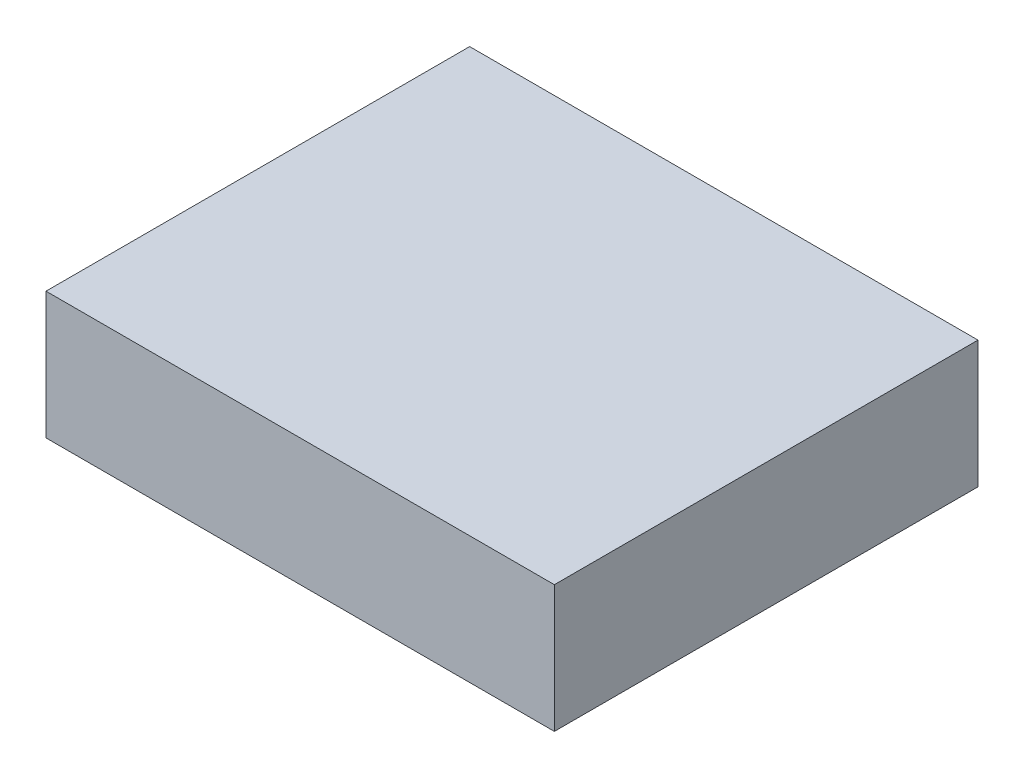
ISO-10303-21;
HEADER;
FILE_DESCRIPTION(('STEP AP214'),'2;1');
FILE_NAME('part.step','',(''),(''),'','','');
FILE_SCHEMA(('AUTOMOTIVE_DESIGN { 1 0 10303 214 1 1 1 1 }'));
ENDSEC;
DATA;
#1=APPLICATION_CONTEXT('core data for automotive mechanical design processes');
#2=APPLICATION_PROTOCOL_DEFINITION('international standard','automotive_design',2000,#1);
#3=PRODUCT_CONTEXT('',#1,'mechanical');
#4=PRODUCT('Part','Part','',(#3));
#5=PRODUCT_RELATED_PRODUCT_CATEGORY('part','',(#4));
#6=PRODUCT_DEFINITION_FORMATION('','',#4);
#7=PRODUCT_DEFINITION_CONTEXT('part definition',#1,'design');
#8=PRODUCT_DEFINITION('design','',#6,#7);
#9=PRODUCT_DEFINITION_SHAPE('','',#8);
#10=(LENGTH_UNIT() NAMED_UNIT(*) SI_UNIT(.MILLI.,.METRE.));
#11=(NAMED_UNIT(*) PLANE_ANGLE_UNIT() SI_UNIT($,.RADIAN.));
#12=(NAMED_UNIT(*) SI_UNIT($,.STERADIAN.) SOLID_ANGLE_UNIT());
#13=UNCERTAINTY_MEASURE_WITH_UNIT(LENGTH_MEASURE(1.E-05),#10,'distance_accuracy_value','');
#14=(GEOMETRIC_REPRESENTATION_CONTEXT(3) GLOBAL_UNCERTAINTY_ASSIGNED_CONTEXT((#13)) GLOBAL_UNIT_ASSIGNED_CONTEXT((#10,
#11,#12)) REPRESENTATION_CONTEXT('',''));
#15=CARTESIAN_POINT('',(0.,0.,0.));
#16=DIRECTION('',(0.,0.,1.));
#17=DIRECTION('',(1.,0.,0.));
#18=AXIS2_PLACEMENT_3D('',#15,#16,#17);
#19=CARTESIAN_POINT('',(-300.,0.,0.));
#20=DIRECTION('',(0.,0.,1.));
#21=DIRECTION('',(0.,-1.,0.));
#22=AXIS2_PLACEMENT_3D('',#19,#20,#21);
#23=PLANE('',#22);
#24=DIRECTION('',(1.,0.,0.));
#25=VECTOR('',#24,1.);
#26=CARTESIAN_POINT('',(-300.,-600.,0.));
#27=LINE('',#26,#25);
#28=CARTESIAN_POINT('',(-300.,-600.,0.));
#29=VERTEX_POINT('',#28);
#30=CARTESIAN_POINT('',(300.,-600.,0.));
#31=VERTEX_POINT('',#30);
#32=EDGE_CURVE('E42',#29,#31,#27,.T.);
#33=ORIENTED_EDGE('',*,*,#32,.T.);
#34=DIRECTION('',(0.,-1.,0.));
#35=VECTOR('',#34,1.);
#36=CARTESIAN_POINT('',(300.,0.,0.));
#37=LINE('',#36,#35);
#38=CARTESIAN_POINT('',(300.,-450.,0.));
#39=VERTEX_POINT('',#38);
#40=EDGE_CURVE('E83',#39,#31,#37,.T.);
#41=ORIENTED_EDGE('',*,*,#40,.F.);
#42=DIRECTION('',(1.,0.,0.));
#43=VECTOR('',#42,1.);
#44=CARTESIAN_POINT('',(-300.,-450.,0.));
#45=LINE('',#44,#43);
#46=CARTESIAN_POINT('',(-300.,-450.,0.));
#47=VERTEX_POINT('',#46);
#48=EDGE_CURVE('E11',#47,#39,#45,.T.);
#49=ORIENTED_EDGE('',*,*,#48,.F.);
#50=DIRECTION('',(0.,-1.,0.));
#51=VECTOR('',#50,1.);
#52=CARTESIAN_POINT('',(-300.,0.,0.));
#53=LINE('',#52,#51);
#54=EDGE_CURVE('E82',#47,#29,#53,.T.);
#55=ORIENTED_EDGE('',*,*,#54,.T.);
#56=EDGE_LOOP('',(#33,#41,#49,#55));
#57=FACE_BOUND('',#56,.T.);
#58=ADVANCED_FACE('F41',(#57),#23,.T.);
#59=CARTESIAN_POINT('',(-300.,-450.,0.));
#60=DIRECTION('',(0.,-1.,0.));
#61=DIRECTION('',(0.,0.,-1.));
#62=AXIS2_PLACEMENT_3D('',#59,#60,#61);
#63=PLANE('',#62);
#64=ORIENTED_EDGE('',*,*,#48,.T.);
#65=DIRECTION('',(0.,0.,-1.));
#66=VECTOR('',#65,1.);
#67=CARTESIAN_POINT('',(300.,-450.,0.));
#68=LINE('',#67,#66);
#69=CARTESIAN_POINT('',(300.,-450.,-500.));
#70=VERTEX_POINT('',#69);
#71=EDGE_CURVE('E97',#39,#70,#68,.T.);
#72=ORIENTED_EDGE('',*,*,#71,.T.);
#73=DIRECTION('',(1.,0.,0.));
#74=VECTOR('',#73,1.);
#75=CARTESIAN_POINT('',(-300.,-450.,-500.));
#76=LINE('',#75,#74);
#77=CARTESIAN_POINT('',(-300.,-450.,-500.));
#78=VERTEX_POINT('',#77);
#79=EDGE_CURVE('E47',#78,#70,#76,.T.);
#80=ORIENTED_EDGE('',*,*,#79,.F.);
#81=DIRECTION('',(0.,0.,-1.));
#82=VECTOR('',#81,1.);
#83=CARTESIAN_POINT('',(-300.,-450.,0.));
#84=LINE('',#83,#82);
#85=EDGE_CURVE('E65',#47,#78,#84,.T.);
#86=ORIENTED_EDGE('',*,*,#85,.F.);
#87=EDGE_LOOP('',(#64,#72,#80,#86));
#88=FACE_BOUND('',#87,.T.);
#89=ADVANCED_FACE('F111',(#88),#63,.F.);
#90=CARTESIAN_POINT('',(-300.,1.85037170770859E-13,-500.));
#91=DIRECTION('',(0.,0.,1.));
#92=DIRECTION('',(0.,-1.,0.));
#93=AXIS2_PLACEMENT_3D('',#90,#91,#92);
#94=PLANE('',#93);
#95=ORIENTED_EDGE('',*,*,#79,.T.);
#96=DIRECTION('',(0.,-1.,0.));
#97=VECTOR('',#96,1.);
#98=CARTESIAN_POINT('',(300.,1.85037170770859E-13,-500.));
#99=LINE('',#98,#97);
#100=CARTESIAN_POINT('',(300.,-600.,-500.));
#101=VERTEX_POINT('',#100);
#102=EDGE_CURVE('E92',#70,#101,#99,.T.);
#103=ORIENTED_EDGE('',*,*,#102,.T.);
#104=DIRECTION('',(1.,0.,0.));
#105=VECTOR('',#104,1.);
#106=CARTESIAN_POINT('',(-300.,-600.,-500.));
#107=LINE('',#106,#105);
#108=CARTESIAN_POINT('',(-300.,-600.,-500.));
#109=VERTEX_POINT('',#108);
#110=EDGE_CURVE('E87',#109,#101,#107,.T.);
#111=ORIENTED_EDGE('',*,*,#110,.F.);
#112=DIRECTION('',(0.,-1.,0.));
#113=VECTOR('',#112,1.);
#114=CARTESIAN_POINT('',(-300.,1.85037170770859E-13,-500.));
#115=LINE('',#114,#113);
#116=EDGE_CURVE('E110',#78,#109,#115,.T.);
#117=ORIENTED_EDGE('',*,*,#116,.F.);
#118=EDGE_LOOP('',(#95,#103,#111,#117));
#119=FACE_BOUND('',#118,.T.);
#120=ADVANCED_FACE('F115',(#119),#94,.F.);
#121=CARTESIAN_POINT('',(-300.,-600.,-1.33226762955019E-13));
#122=DIRECTION('',(0.,-1.,0.));
#123=DIRECTION('',(0.,0.,-1.));
#124=AXIS2_PLACEMENT_3D('',#121,#122,#123);
#125=PLANE('',#124);
#126=ORIENTED_EDGE('',*,*,#110,.T.);
#127=DIRECTION('',(0.,0.,-1.));
#128=VECTOR('',#127,1.);
#129=CARTESIAN_POINT('',(300.,-600.,-1.33226762955019E-13));
#130=LINE('',#129,#128);
#131=EDGE_CURVE('E90',#31,#101,#130,.T.);
#132=ORIENTED_EDGE('',*,*,#131,.F.);
#133=ORIENTED_EDGE('',*,*,#32,.F.);
#134=DIRECTION('',(0.,0.,-1.));
#135=VECTOR('',#134,1.);
#136=CARTESIAN_POINT('',(-300.,-600.,-1.33226762955019E-13));
#137=LINE('',#136,#135);
#138=EDGE_CURVE('E104',#29,#109,#137,.T.);
#139=ORIENTED_EDGE('',*,*,#138,.T.);
#140=EDGE_LOOP('',(#126,#132,#133,#139));
#141=FACE_BOUND('',#140,.T.);
#142=ADVANCED_FACE('F89',(#141),#125,.T.);
#143=CARTESIAN_POINT('',(-300.,0.,0.));
#144=DIRECTION('',(1.,0.,0.));
#145=DIRECTION('',(0.,0.,-1.));
#146=AXIS2_PLACEMENT_3D('',#143,#144,#145);
#147=PLANE('',#146);
#148=ORIENTED_EDGE('',*,*,#54,.F.);
#149=ORIENTED_EDGE('',*,*,#85,.T.);
#150=ORIENTED_EDGE('',*,*,#116,.T.);
#151=ORIENTED_EDGE('',*,*,#138,.F.);
#152=EDGE_LOOP('',(#148,#149,#150,#151));
#153=FACE_BOUND('',#152,.T.);
#154=ADVANCED_FACE('F113',(#153),#147,.F.);
#155=CARTESIAN_POINT('',(300.,0.,0.));
#156=DIRECTION('',(1.,0.,0.));
#157=DIRECTION('',(0.,0.,-1.));
#158=AXIS2_PLACEMENT_3D('',#155,#156,#157);
#159=PLANE('',#158);
#160=ORIENTED_EDGE('',*,*,#40,.T.);
#161=ORIENTED_EDGE('',*,*,#131,.T.);
#162=ORIENTED_EDGE('',*,*,#102,.F.);
#163=ORIENTED_EDGE('',*,*,#71,.F.);
#164=EDGE_LOOP('',(#160,#161,#162,#163));
#165=FACE_BOUND('',#164,.T.);
#166=ADVANCED_FACE('F100',(#165),#159,.T.);
#167=CLOSED_SHELL('',(#58,#89,#120,#142,#154,#166));
#168=MANIFOLD_SOLID_BREP('B2',#167);
#169=ADVANCED_BREP_SHAPE_REPRESENTATION('',(#18,#168),#14);
#170=SHAPE_DEFINITION_REPRESENTATION(#9,#169);
ENDSEC;
END-ISO-10303-21;
